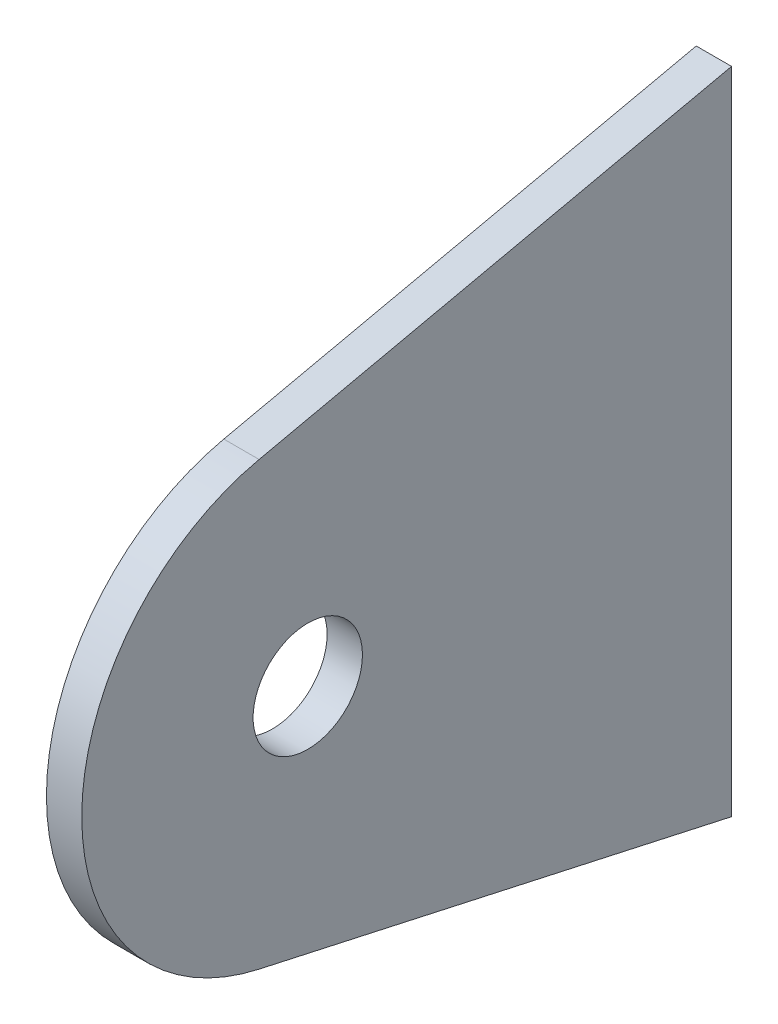
ISO-10303-21;
HEADER;
FILE_DESCRIPTION(('STEP AP214'),'2;1');
FILE_NAME('part.step','',(''),(''),'','','');
FILE_SCHEMA(('AUTOMOTIVE_DESIGN { 1 0 10303 214 1 1 1 1 }'));
ENDSEC;
DATA;
#1=APPLICATION_CONTEXT('core data for automotive mechanical design processes');
#2=APPLICATION_PROTOCOL_DEFINITION('international standard','automotive_design',2000,#1);
#3=PRODUCT_CONTEXT('',#1,'mechanical');
#4=PRODUCT('Part','Part','',(#3));
#5=PRODUCT_RELATED_PRODUCT_CATEGORY('part','',(#4));
#6=PRODUCT_DEFINITION_FORMATION('','',#4);
#7=PRODUCT_DEFINITION_CONTEXT('part definition',#1,'design');
#8=PRODUCT_DEFINITION('design','',#6,#7);
#9=PRODUCT_DEFINITION_SHAPE('','',#8);
#10=(LENGTH_UNIT() NAMED_UNIT(*) SI_UNIT(.MILLI.,.METRE.));
#11=(NAMED_UNIT(*) PLANE_ANGLE_UNIT() SI_UNIT($,.RADIAN.));
#12=(NAMED_UNIT(*) SI_UNIT($,.STERADIAN.) SOLID_ANGLE_UNIT());
#13=UNCERTAINTY_MEASURE_WITH_UNIT(LENGTH_MEASURE(1.E-05),#10,'distance_accuracy_value','');
#14=(GEOMETRIC_REPRESENTATION_CONTEXT(3) GLOBAL_UNCERTAINTY_ASSIGNED_CONTEXT((#13)) GLOBAL_UNIT_ASSIGNED_CONTEXT((#10,
#11,#12)) REPRESENTATION_CONTEXT('',''));
#15=CARTESIAN_POINT('',(0.,0.,0.));
#16=DIRECTION('',(0.,0.,1.));
#17=DIRECTION('',(1.,0.,0.));
#18=AXIS2_PLACEMENT_3D('',#15,#16,#17);
#19=CARTESIAN_POINT('',(0.79375,0.,0.));
#20=DIRECTION('',(-1.,0.,0.));
#21=DIRECTION('',(0.,0.,1.));
#22=AXIS2_PLACEMENT_3D('',#19,#20,#21);
#23=CYLINDRICAL_SURFACE('',#22,10.16);
#24=CARTESIAN_POINT('',(-0.79375,0.,0.));
#25=DIRECTION('',(1.,0.,0.));
#26=DIRECTION('',(0.,0.,-1.));
#27=AXIS2_PLACEMENT_3D('',#24,#25,#26);
#28=CIRCLE('',#27,10.16);
#29=CARTESIAN_POINT('',(-0.79375,9.92162483842257,2.18791237612396));
#30=VERTEX_POINT('',#29);
#31=CARTESIAN_POINT('',(-0.79375,-9.92162483842257,2.18791237612396));
#32=VERTEX_POINT('',#31);
#33=EDGE_CURVE('E109',#30,#32,#28,.T.);
#34=ORIENTED_EDGE('',*,*,#33,.T.);
#35=DIRECTION('',(-1.,0.,0.));
#36=VECTOR('',#35,1.);
#37=CARTESIAN_POINT('',(0.79375,-9.92162483842257,2.18791237612396));
#38=LINE('',#37,#36);
#39=CARTESIAN_POINT('',(0.79375,-9.92162483842257,2.18791237612396));
#40=VERTEX_POINT('',#39);
#41=EDGE_CURVE('E11',#40,#32,#38,.T.);
#42=ORIENTED_EDGE('',*,*,#41,.F.);
#43=CARTESIAN_POINT('',(0.79375,0.,0.));
#44=DIRECTION('',(1.,0.,0.));
#45=DIRECTION('',(0.,0.,-1.));
#46=AXIS2_PLACEMENT_3D('',#43,#44,#45);
#47=CIRCLE('',#46,10.16);
#48=CARTESIAN_POINT('',(0.79375,9.92162483842257,2.18791237612396));
#49=VERTEX_POINT('',#48);
#50=EDGE_CURVE('E92',#49,#40,#47,.T.);
#51=ORIENTED_EDGE('',*,*,#50,.F.);
#52=DIRECTION('',(-1.,0.,0.));
#53=VECTOR('',#52,1.);
#54=CARTESIAN_POINT('',(0.79375,9.92162483842257,2.18791237612396));
#55=LINE('',#54,#53);
#56=EDGE_CURVE('E105',#49,#30,#55,.T.);
#57=ORIENTED_EDGE('',*,*,#56,.T.);
#58=EDGE_LOOP('',(#34,#42,#51,#57));
#59=FACE_BOUND('',#58,.T.);
#60=ADVANCED_FACE('F40',(#59),#23,.T.);
#61=CARTESIAN_POINT('',(0.79375,-9.92162483842257,2.18791237612396));
#62=DIRECTION('',(0.,0.976537877797497,-0.215345706311414));
#63=DIRECTION('',(0.,0.215345706311414,0.976537877797497));
#64=AXIS2_PLACEMENT_3D('',#61,#62,#63);
#65=PLANE('',#64);
#66=DIRECTION('',(0.,-0.215345706311414,-0.976537877797497));
#67=VECTOR('',#66,1.);
#68=CARTESIAN_POINT('',(-0.79375,-9.92162483842257,2.18791237612396));
#69=LINE('',#68,#67);
#70=CARTESIAN_POINT('',(-0.79375,-14.605,-19.05));
#71=VERTEX_POINT('',#70);
#72=EDGE_CURVE('E97',#32,#71,#69,.T.);
#73=ORIENTED_EDGE('',*,*,#72,.T.);
#74=DIRECTION('',(-1.,0.,0.));
#75=VECTOR('',#74,1.);
#76=CARTESIAN_POINT('',(0.79375,-14.605,-19.05));
#77=LINE('',#76,#75);
#78=CARTESIAN_POINT('',(0.79375,-14.605,-19.05));
#79=VERTEX_POINT('',#78);
#80=EDGE_CURVE('E49',#79,#71,#77,.T.);
#81=ORIENTED_EDGE('',*,*,#80,.F.);
#82=DIRECTION('',(0.,-0.215345706311414,-0.976537877797497));
#83=VECTOR('',#82,1.);
#84=CARTESIAN_POINT('',(0.79375,-9.92162483842257,2.18791237612396));
#85=LINE('',#84,#83);
#86=EDGE_CURVE('E87',#40,#79,#85,.T.);
#87=ORIENTED_EDGE('',*,*,#86,.F.);
#88=ORIENTED_EDGE('',*,*,#41,.T.);
#89=EDGE_LOOP('',(#73,#81,#87,#88));
#90=FACE_BOUND('',#89,.T.);
#91=ADVANCED_FACE('F96',(#90),#65,.F.);
#92=CARTESIAN_POINT('',(0.79375,-14.605,-19.05));
#93=DIRECTION('',(0.,0.,1.));
#94=DIRECTION('',(1.,0.,0.));
#95=AXIS2_PLACEMENT_3D('',#92,#93,#94);
#96=PLANE('',#95);
#97=DIRECTION('',(0.,1.,0.));
#98=VECTOR('',#97,1.);
#99=CARTESIAN_POINT('',(-0.79375,-14.605,-19.05));
#100=LINE('',#99,#98);
#101=CARTESIAN_POINT('',(-0.79375,14.605,-19.05));
#102=VERTEX_POINT('',#101);
#103=EDGE_CURVE('E74',#71,#102,#100,.T.);
#104=ORIENTED_EDGE('',*,*,#103,.T.);
#105=DIRECTION('',(-1.,0.,0.));
#106=VECTOR('',#105,1.);
#107=CARTESIAN_POINT('',(0.79375,14.605,-19.05));
#108=LINE('',#107,#106);
#109=CARTESIAN_POINT('',(0.79375,14.605,-19.05));
#110=VERTEX_POINT('',#109);
#111=EDGE_CURVE('E99',#110,#102,#108,.T.);
#112=ORIENTED_EDGE('',*,*,#111,.F.);
#113=DIRECTION('',(0.,1.,0.));
#114=VECTOR('',#113,1.);
#115=CARTESIAN_POINT('',(0.79375,-14.605,-19.05));
#116=LINE('',#115,#114);
#117=EDGE_CURVE('E90',#79,#110,#116,.T.);
#118=ORIENTED_EDGE('',*,*,#117,.F.);
#119=ORIENTED_EDGE('',*,*,#80,.T.);
#120=EDGE_LOOP('',(#104,#112,#118,#119));
#121=FACE_BOUND('',#120,.T.);
#122=ADVANCED_FACE('F100',(#121),#96,.F.);
#123=CARTESIAN_POINT('',(0.79375,9.92162483842257,2.18791237612396));
#124=DIRECTION('',(0.,-0.976537877797497,-0.215345706311414));
#125=DIRECTION('',(0.,0.215345706311414,-0.976537877797497));
#126=AXIS2_PLACEMENT_3D('',#123,#124,#125);
#127=PLANE('',#126);
#128=DIRECTION('',(0.,-0.215345706311414,0.976537877797497));
#129=VECTOR('',#128,1.);
#130=CARTESIAN_POINT('',(-0.79375,9.92162483842257,2.18791237612396));
#131=LINE('',#130,#129);
#132=EDGE_CURVE('E80',#102,#30,#131,.T.);
#133=ORIENTED_EDGE('',*,*,#132,.T.);
#134=ORIENTED_EDGE('',*,*,#56,.F.);
#135=DIRECTION('',(0.,-0.215345706311414,0.976537877797497));
#136=VECTOR('',#135,1.);
#137=CARTESIAN_POINT('',(0.79375,9.92162483842257,2.18791237612396));
#138=LINE('',#137,#136);
#139=EDGE_CURVE('E57',#110,#49,#138,.T.);
#140=ORIENTED_EDGE('',*,*,#139,.F.);
#141=ORIENTED_EDGE('',*,*,#111,.T.);
#142=EDGE_LOOP('',(#133,#134,#140,#141));
#143=FACE_BOUND('',#142,.T.);
#144=ADVANCED_FACE('F124',(#143),#127,.F.);
#145=CARTESIAN_POINT('',(0.79375,0.,0.));
#146=DIRECTION('',(1.,0.,0.));
#147=DIRECTION('',(0.,0.,-1.));
#148=AXIS2_PLACEMENT_3D('',#145,#146,#147);
#149=PLANE('',#148);
#150=CARTESIAN_POINT('',(0.793750000000001,0.,0.));
#151=DIRECTION('',(1.,0.,0.));
#152=DIRECTION('',(0.,0.,-1.));
#153=AXIS2_PLACEMENT_3D('',#150,#151,#152);
#154=CIRCLE('',#153,2.45744999999999);
#155=CARTESIAN_POINT('',(0.793750000000001,0.,-2.45744999999999));
#156=VERTEX_POINT('',#155);
#157=EDGE_CURVE('E135',#156,#156,#154,.T.);
#158=ORIENTED_EDGE('',*,*,#157,.F.);
#159=EDGE_LOOP('',(#158));
#160=FACE_BOUND('',#159,.T.);
#161=ORIENTED_EDGE('',*,*,#50,.T.);
#162=ORIENTED_EDGE('',*,*,#86,.T.);
#163=ORIENTED_EDGE('',*,*,#117,.T.);
#164=ORIENTED_EDGE('',*,*,#139,.T.);
#165=EDGE_LOOP('',(#161,#162,#163,#164));
#166=FACE_BOUND('',#165,.T.);
#167=ADVANCED_FACE('F88',(#160,#166),#149,.T.);
#168=CARTESIAN_POINT('',(-0.79375,0.,0.));
#169=DIRECTION('',(1.,0.,0.));
#170=DIRECTION('',(0.,0.,-1.));
#171=AXIS2_PLACEMENT_3D('',#168,#169,#170);
#172=PLANE('',#171);
#173=CARTESIAN_POINT('',(-0.79375,0.,0.));
#174=DIRECTION('',(1.,0.,0.));
#175=DIRECTION('',(0.,0.,-1.));
#176=AXIS2_PLACEMENT_3D('',#173,#174,#175);
#177=CIRCLE('',#176,2.45744999999999);
#178=CARTESIAN_POINT('',(-0.79375,0.,-2.45744999999999));
#179=VERTEX_POINT('',#178);
#180=EDGE_CURVE('E113',#179,#179,#177,.T.);
#181=ORIENTED_EDGE('',*,*,#180,.T.);
#182=EDGE_LOOP('',(#181));
#183=FACE_BOUND('',#182,.T.);
#184=ORIENTED_EDGE('',*,*,#33,.F.);
#185=ORIENTED_EDGE('',*,*,#132,.F.);
#186=ORIENTED_EDGE('',*,*,#103,.F.);
#187=ORIENTED_EDGE('',*,*,#72,.F.);
#188=EDGE_LOOP('',(#184,#185,#186,#187));
#189=FACE_BOUND('',#188,.T.);
#190=ADVANCED_FACE('F127',(#183,#189),#172,.F.);
#191=CARTESIAN_POINT('',(0.79375,0.,0.));
#192=DIRECTION('',(1.,0.,0.));
#193=DIRECTION('',(0.,0.,-1.));
#194=AXIS2_PLACEMENT_3D('',#191,#192,#193);
#195=CYLINDRICAL_SURFACE('',#194,2.45744999999999);
#196=ORIENTED_EDGE('',*,*,#180,.F.);
#197=EDGE_LOOP('',(#196));
#198=FACE_BOUND('',#197,.T.);
#199=ORIENTED_EDGE('',*,*,#157,.T.);
#200=EDGE_LOOP('',(#199));
#201=FACE_BOUND('',#200,.T.);
#202=ADVANCED_FACE('F141',(#198,#201),#195,.F.);
#203=CLOSED_SHELL('',(#60,#91,#122,#144,#167,#190,#202));
#204=MANIFOLD_SOLID_BREP('B2',#203);
#205=ADVANCED_BREP_SHAPE_REPRESENTATION('',(#18,#204),#14);
#206=SHAPE_DEFINITION_REPRESENTATION(#9,#205);
ENDSEC;
END-ISO-10303-21;
